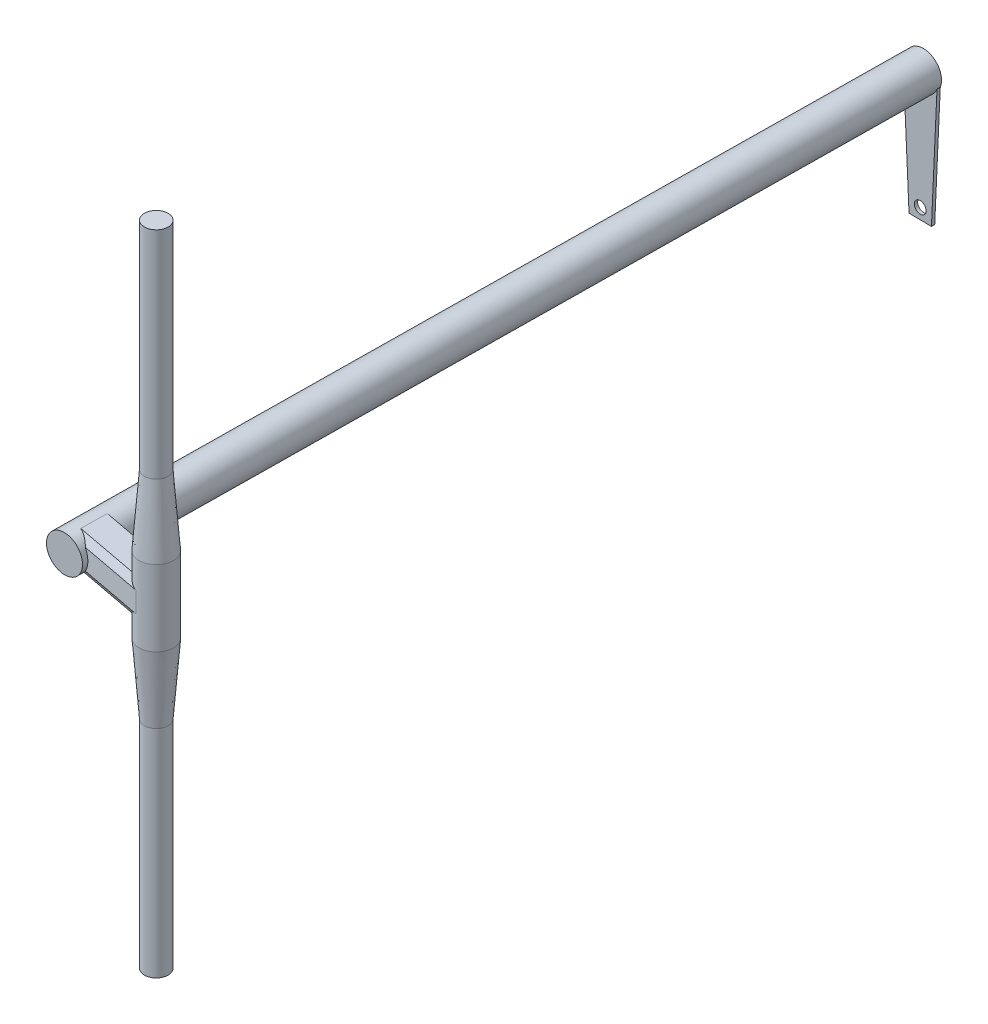
ISO-10303-21;
HEADER;
FILE_DESCRIPTION(('STEP AP214'),'2;1');
FILE_NAME('part.step','',(''),(''),'','','');
FILE_SCHEMA(('AUTOMOTIVE_DESIGN { 1 0 10303 214 1 1 1 1 }'));
ENDSEC;
DATA;
#1=APPLICATION_CONTEXT('core data for automotive mechanical design processes');
#2=APPLICATION_PROTOCOL_DEFINITION('international standard','automotive_design',2000,#1);
#3=PRODUCT_CONTEXT('',#1,'mechanical');
#4=PRODUCT('Part','Part','',(#3));
#5=PRODUCT_RELATED_PRODUCT_CATEGORY('part','',(#4));
#6=PRODUCT_DEFINITION_FORMATION('','',#4);
#7=PRODUCT_DEFINITION_CONTEXT('part definition',#1,'design');
#8=PRODUCT_DEFINITION('design','',#6,#7);
#9=PRODUCT_DEFINITION_SHAPE('','',#8);
#10=(LENGTH_UNIT() NAMED_UNIT(*) SI_UNIT(.MILLI.,.METRE.));
#11=(NAMED_UNIT(*) PLANE_ANGLE_UNIT() SI_UNIT($,.RADIAN.));
#12=(NAMED_UNIT(*) SI_UNIT($,.STERADIAN.) SOLID_ANGLE_UNIT());
#13=UNCERTAINTY_MEASURE_WITH_UNIT(LENGTH_MEASURE(1.E-05),#10,'distance_accuracy_value','');
#14=(GEOMETRIC_REPRESENTATION_CONTEXT(3) GLOBAL_UNCERTAINTY_ASSIGNED_CONTEXT((#13)) GLOBAL_UNIT_ASSIGNED_CONTEXT((#10,
#11,#12)) REPRESENTATION_CONTEXT('',''));
#15=CARTESIAN_POINT('',(0.,0.,0.));
#16=DIRECTION('',(0.,0.,1.));
#17=DIRECTION('',(1.,0.,0.));
#18=AXIS2_PLACEMENT_3D('',#15,#16,#17);
#19=CARTESIAN_POINT('',(-8.79567230162609,0.,724.946643656457));
#20=DIRECTION('',(0.0121319617953464,0.,-0.999926405043389));
#21=DIRECTION('',(-0.999926405043389,0.,-0.0121319617953465));
#22=AXIS2_PLACEMENT_3D('',#19,#20,#21);
#23=CYLINDRICAL_SURFACE('',#22,16.9);
#24=CARTESIAN_POINT('',(0.740049669516222,0.,-60.9955107076468));
#25=DIRECTION('',(0.0121319617953463,0.,-0.999926405043389));
#26=DIRECTION('',(-0.999926405043389,0.,-0.0121319617953463));
#27=AXIS2_PLACEMENT_3D('',#24,#25,#26);
#28=CIRCLE('',#27,16.9);
#29=CARTESIAN_POINT('',(-14.9711540024849,-6.22348315051543,-61.1861324591539));
#30=VERTEX_POINT('',#29);
#31=CARTESIAN_POINT('',(16.4512533415172,-6.22348315051599,-60.8048889561396));
#32=VERTEX_POINT('',#31);
#33=EDGE_CURVE('E218',#30,#32,#28,.T.);
#34=ORIENTED_EDGE('',*,*,#33,.F.);
#35=DIRECTION('',(0.0121319617953464,0.,-0.999926405043389));
#36=VECTOR('',#35,1.);
#37=CARTESIAN_POINT('',(-24.5068759736271,-6.22348315051575,724.75602190495));
#38=LINE('',#37,#36);
#39=CARTESIAN_POINT('',(-15.007549887871,-6.22348315051544,-58.1863532440237));
#40=VERTEX_POINT('',#39);
#41=EDGE_CURVE('E183',#30,#40,#38,.F.);
#42=ORIENTED_EDGE('',*,*,#41,.T.);
#43=CARTESIAN_POINT('',(0.703653784130183,0.,-57.9957314925166));
#44=DIRECTION('',(0.0121319617953463,0.,-0.999926405043389));
#45=DIRECTION('',(-0.999926405043389,0.,-0.0121319617953464));
#46=AXIS2_PLACEMENT_3D('',#43,#44,#45);
#47=CIRCLE('',#46,16.9);
#48=CARTESIAN_POINT('',(16.4148574561311,-6.223483150516,-57.8051097410094));
#49=VERTEX_POINT('',#48);
#50=EDGE_CURVE('E231',#49,#40,#47,.T.);
#51=ORIENTED_EDGE('',*,*,#50,.F.);
#52=DIRECTION('',(0.0121319617953464,0.,-0.999926405043389));
#53=VECTOR('',#52,1.);
#54=CARTESIAN_POINT('',(6.91553137037498,-6.22348315051569,725.137265407964));
#55=LINE('',#54,#53);
#56=EDGE_CURVE('E151',#49,#32,#55,.T.);
#57=ORIENTED_EDGE('',*,*,#56,.T.);
#58=EDGE_LOOP('',(#34,#42,#51,#57));
#59=FACE_BOUND('',#58,.T.);
#60=DIRECTION('',(0.0121319617953464,0.,-0.999926405043389));
#61=VECTOR('',#60,1.);
#62=CARTESIAN_POINT('',(-5.14080792450899,16.5,724.990987594938));
#63=LINE('',#62,#61);
#64=CARTESIAN_POINT('',(-5.00342810130972,16.5,713.668028039474));
#65=VERTEX_POINT('',#64);
#66=CARTESIAN_POINT('',(-4.708790597851,16.5,689.38375937837));
#67=VERTEX_POINT('',#66);
#68=EDGE_CURVE('E223',#65,#67,#63,.T.);
#69=ORIENTED_EDGE('',*,*,#68,.T.);
#70=CARTESIAN_POINT('',(-8.23848059248754,0.,679.022438483589));
#71=DIRECTION('',(-0.16071963414222,-0.500000000000007,0.850981315424248));
#72=DIRECTION('',(-0.239292476715524,-0.816727178648459,-0.525067449233219));
#73=AXIS2_PLACEMENT_3D('',#70,#71,#72);
#74=ELLIPSE('',#73,19.8154807767517,16.9);
#75=CARTESIAN_POINT('',(5.64014694284135,9.50000000000011,687.22540112607));
#76=VERTEX_POINT('',#75);
#77=EDGE_CURVE('E251',#67,#76,#74,.F.);
#78=ORIENTED_EDGE('',*,*,#77,.T.);
#79=CARTESIAN_POINT('',(-8.30604882413043,0.,684.591468464192));
#80=DIRECTION('',(0.185583048072138,0.,-0.982628583071068));
#81=DIRECTION('',(-0.982628583071068,0.,-0.185583048072138));
#82=AXIS2_PLACEMENT_3D('',#79,#80,#81);
#83=ELLIPSE('',#82,17.1607097408691,16.9);
#84=CARTESIAN_POINT('',(5.64014694284137,-9.50000000000009,687.22540112607));
#85=VERTEX_POINT('',#84);
#86=EDGE_CURVE('E221',#76,#85,#83,.T.);
#87=ORIENTED_EDGE('',*,*,#86,.T.);
#88=CARTESIAN_POINT('',(-8.23848059248754,0.,679.022438483589));
#89=DIRECTION('',(-0.16071963414222,0.500000000000007,0.850981315424248));
#90=DIRECTION('',(-0.239292476715524,0.816727178648459,-0.525067449233219));
#91=AXIS2_PLACEMENT_3D('',#88,#89,#90);
#92=ELLIPSE('',#91,19.8154807767517,16.9);
#93=CARTESIAN_POINT('',(-4.70879059785085,-16.5,689.38375937837));
#94=VERTEX_POINT('',#93);
#95=EDGE_CURVE('E258',#85,#94,#92,.F.);
#96=ORIENTED_EDGE('',*,*,#95,.T.);
#97=DIRECTION('',(0.0121319617953464,0.,-0.999926405043389));
#98=VECTOR('',#97,1.);
#99=CARTESIAN_POINT('',(-5.14080792450884,-16.5,724.990987594938));
#100=LINE('',#99,#98);
#101=CARTESIAN_POINT('',(-5.00342810130957,-16.5,713.668028039474));
#102=VERTEX_POINT('',#101);
#103=EDGE_CURVE('E229',#94,#102,#100,.F.);
#104=ORIENTED_EDGE('',*,*,#103,.T.);
#105=CARTESIAN_POINT('',(-8.76782879533736,0.,722.651758656262));
#106=DIRECTION('',(0.16071963414222,0.500000000000004,-0.85098131542425));
#107=DIRECTION('',(-0.239292476715526,-0.81672717864846,-0.525067449233216));
#108=AXIS2_PLACEMENT_3D('',#105,#106,#107);
#109=ELLIPSE('',#108,19.8154807767517,16.9);
#110=CARTESIAN_POINT('',(5.24593520327712,-9.50000000000042,719.716661337536));
#111=VERTEX_POINT('',#110);
#112=EDGE_CURVE('E70',#102,#111,#109,.F.);
#113=ORIENTED_EDGE('',*,*,#112,.T.);
#114=CARTESIAN_POINT('',(-8.70026056369447,0.,717.082728675658));
#115=DIRECTION('',(-0.185583048072138,0.,0.982628583071068));
#116=DIRECTION('',(-0.982628583071068,0.,-0.185583048072138));
#117=AXIS2_PLACEMENT_3D('',#114,#115,#116);
#118=ELLIPSE('',#117,17.1607097408691,16.9);
#119=CARTESIAN_POINT('',(5.24593520327709,9.50000000000046,719.716661337536));
#120=VERTEX_POINT('',#119);
#121=EDGE_CURVE('E227',#111,#120,#118,.T.);
#122=ORIENTED_EDGE('',*,*,#121,.T.);
#123=CARTESIAN_POINT('',(-8.76782879533736,0.,722.651758656262));
#124=DIRECTION('',(0.16071963414222,-0.500000000000004,-0.85098131542425));
#125=DIRECTION('',(-0.239292476715526,0.81672717864846,-0.525067449233216));
#126=AXIS2_PLACEMENT_3D('',#123,#124,#125);
#127=ELLIPSE('',#126,19.8154807767517,16.9);
#128=EDGE_CURVE('E265',#120,#65,#127,.F.);
#129=ORIENTED_EDGE('',*,*,#128,.T.);
#130=EDGE_LOOP('',(#69,#78,#87,#96,#104,#113,#122,#129));
#131=FACE_BOUND('',#130,.T.);
#132=CARTESIAN_POINT('',(-8.79567230162609,0.,724.946643656457));
#133=DIRECTION('',(-0.0121319617953462,0.,0.999926405043389));
#134=DIRECTION('',(0.999926405043389,0.,0.0121319617953462));
#135=AXIS2_PLACEMENT_3D('',#132,#133,#134);
#136=CIRCLE('',#135,16.9);
#137=CARTESIAN_POINT('',(8.1030839436072,0.,725.151673810799));
#138=VERTEX_POINT('',#137);
#139=EDGE_CURVE('E213',#138,#138,#136,.T.);
#140=ORIENTED_EDGE('',*,*,#139,.F.);
#141=EDGE_LOOP('',(#140));
#142=FACE_BOUND('',#141,.T.);
#143=ADVANCED_FACE('F59',(#59,#131,#142),#23,.T.);
#144=CARTESIAN_POINT('',(-8.79567230172777,-4.28049522910312E-12,724.946643656456));
#145=DIRECTION('',(0.0121319617954866,0.,-0.999926405043388));
#146=DIRECTION('',(-0.999926405043388,0.,-0.0121319617954866));
#147=AXIS2_PLACEMENT_3D('',#144,#145,#146);
#148=PLANE('',#147);
#149=ORIENTED_EDGE('',*,*,#139,.T.);
#150=EDGE_LOOP('',(#149));
#151=FACE_BOUND('',#150,.T.);
#152=ADVANCED_FACE('F304',(#151),#148,.F.);
#153=CARTESIAN_POINT('',(0.740049669516125,0.,-60.9955107076468));
#154=DIRECTION('',(0.0121319617953463,0.,-0.999926405043389));
#155=DIRECTION('',(-0.999926405043389,0.,-0.0121319617953463));
#156=AXIS2_PLACEMENT_3D('',#153,#154,#155);
#157=PLANE('',#156);
#158=ORIENTED_EDGE('',*,*,#33,.T.);
#159=DIRECTION('',(-0.0461658037438821,-0.998933633845071,-0.00056012298949935));
#160=VECTOR('',#159,1.);
#161=CARTESIAN_POINT('',(16.7388721502104,0.,-60.8013993189212));
#162=LINE('',#161,#160);
#163=CARTESIAN_POINT('',(11.2392769224717,-119.,-60.8681251087956));
#164=VERTEX_POINT('',#163);
#165=EDGE_CURVE('E180',#32,#164,#162,.T.);
#166=ORIENTED_EDGE('',*,*,#165,.T.);
#167=DIRECTION('',(-0.999926405043389,0.,-0.0121319617953463));
#168=VECTOR('',#167,1.);
#169=CARTESIAN_POINT('',(11.2392769224717,-119.,-60.8681251087956));
#170=LINE('',#169,#168);
#171=CARTESIAN_POINT('',(-9.75917758343947,-119.,-61.1228963064979));
#172=VERTEX_POINT('',#171);
#173=EDGE_CURVE('E170',#164,#172,#170,.T.);
#174=ORIENTED_EDGE('',*,*,#173,.T.);
#175=DIRECTION('',(-0.0461658037438821,0.998933633845071,-0.00056012298949935));
#176=VECTOR('',#175,1.);
#177=CARTESIAN_POINT('',(-9.75917758343947,-119.,-61.1228963064979));
#178=LINE('',#177,#176);
#179=EDGE_CURVE('E159',#172,#30,#178,.T.);
#180=ORIENTED_EDGE('',*,*,#179,.T.);
#181=EDGE_LOOP('',(#158,#166,#174,#180));
#182=FACE_BOUND('',#181,.T.);
#183=CARTESIAN_POINT('',(0.740049669515793,-109.,-60.9955107076468));
#184=DIRECTION('',(0.0121319617953463,0.,-0.999926405043389));
#185=DIRECTION('',(-0.999926405043389,0.,-0.0121319617953463));
#186=AXIS2_PLACEMENT_3D('',#183,#184,#185);
#187=CIRCLE('',#186,5.50000000000023);
#188=CARTESIAN_POINT('',(-4.75954555822308,-109.,-61.0622364975212));
#189=VERTEX_POINT('',#188);
#190=EDGE_CURVE('E533',#189,#189,#187,.T.);
#191=ORIENTED_EDGE('',*,*,#190,.F.);
#192=EDGE_LOOP('',(#191));
#193=FACE_BOUND('',#192,.T.);
#194=ADVANCED_FACE('F312',(#182,#193),#157,.T.);
#195=CARTESIAN_POINT('',(81.6028370847578,-16.5,734.137722190684));
#196=DIRECTION('',(0.,-1.,0.));
#197=DIRECTION('',(0.,0.,-1.));
#198=AXIS2_PLACEMENT_3D('',#195,#196,#197);
#199=PLANE('',#198);
#200=ORIENTED_EDGE('',*,*,#103,.F.);
#201=DIRECTION('',(0.982628583071068,0.,0.185583048072138));
#202=VECTOR('',#201,1.);
#203=CARTESIAN_POINT('',(86.7914696637359,-16.5,706.664853671056));
#204=LINE('',#203,#202);
#205=CARTESIAN_POINT('',(57.9784640597501,-16.5,701.223117600856));
#206=VERTEX_POINT('',#205);
#207=EDGE_CURVE('E247',#94,#206,#204,.T.);
#208=ORIENTED_EDGE('',*,*,#207,.T.);
#209=CARTESIAN_POINT('',(66.2043276983739,-16.5,714.946643656457));
#210=DIRECTION('',(0.,-1.,0.));
#211=DIRECTION('',(0.,0.,-1.));
#212=AXIS2_PLACEMENT_3D('',#209,#210,#211);
#213=CIRCLE('',#212,16.);
#214=CARTESIAN_POINT('',(53.5398564401023,-16.5,724.724739981837));
#215=VERTEX_POINT('',#214);
#216=EDGE_CURVE('E204',#215,#206,#213,.T.);
#217=ORIENTED_EDGE('',*,*,#216,.F.);
#218=DIRECTION('',(-0.982628583071068,0.,-0.185583048072138));
#219=VECTOR('',#218,1.);
#220=CARTESIAN_POINT('',(82.3528620440881,-16.5,730.166476052037));
#221=LINE('',#220,#219);
#222=EDGE_CURVE('E244',#215,#102,#221,.T.);
#223=ORIENTED_EDGE('',*,*,#222,.T.);
#224=EDGE_LOOP('',(#200,#208,#217,#223));
#225=FACE_BOUND('',#224,.T.);
#226=ADVANCED_FACE('F277',(#225),#199,.T.);
#227=CARTESIAN_POINT('',(81.6028370847578,16.5,734.137722190684));
#228=DIRECTION('',(0.,1.,0.));
#229=DIRECTION('',(0.,0.,1.));
#230=AXIS2_PLACEMENT_3D('',#227,#228,#229);
#231=PLANE('',#230);
#232=CARTESIAN_POINT('',(66.2043276983739,16.5,714.946643656457));
#233=DIRECTION('',(0.,1.,0.));
#234=DIRECTION('',(0.,0.,1.));
#235=AXIS2_PLACEMENT_3D('',#232,#233,#234);
#236=CIRCLE('',#235,16.);
#237=CARTESIAN_POINT('',(57.9784640597501,16.5,701.223117600856));
#238=VERTEX_POINT('',#237);
#239=CARTESIAN_POINT('',(53.5398564401023,16.5,724.724739981837));
#240=VERTEX_POINT('',#239);
#241=EDGE_CURVE('E206',#238,#240,#236,.T.);
#242=ORIENTED_EDGE('',*,*,#241,.F.);
#243=DIRECTION('',(-0.982628583071068,0.,-0.185583048072138));
#244=VECTOR('',#243,1.);
#245=CARTESIAN_POINT('',(86.7914696637359,16.5,706.664853671056));
#246=LINE('',#245,#244);
#247=EDGE_CURVE('E240',#238,#67,#246,.T.);
#248=ORIENTED_EDGE('',*,*,#247,.T.);
#249=ORIENTED_EDGE('',*,*,#68,.F.);
#250=DIRECTION('',(0.982628583071068,0.,0.185583048072138));
#251=VECTOR('',#250,1.);
#252=CARTESIAN_POINT('',(82.3528620440881,16.5,730.166476052037));
#253=LINE('',#252,#251);
#254=EDGE_CURVE('E232',#65,#240,#253,.T.);
#255=ORIENTED_EDGE('',*,*,#254,.T.);
#256=EDGE_LOOP('',(#242,#248,#249,#255));
#257=FACE_BOUND('',#256,.T.);
#258=ADVANCED_FACE('F292',(#257),#231,.T.);
#259=CARTESIAN_POINT('',(81.6028370847578,16.5,734.137722190684));
#260=DIRECTION('',(-0.185583048072138,0.,0.982628583071068));
#261=DIRECTION('',(0.982628583071068,0.,0.185583048072138));
#262=AXIS2_PLACEMENT_3D('',#259,#260,#261);
#263=PLANE('',#262);
#264=DIRECTION('',(0.,1.,0.));
#265=VECTOR('',#264,1.);
#266=CARTESIAN_POINT('',(63.2349989292197,300.,730.668700985594));
#267=LINE('',#266,#265);
#268=CARTESIAN_POINT('',(63.2349989292197,-9.5000000000004,730.668700985594));
#269=VERTEX_POINT('',#268);
#270=CARTESIAN_POINT('',(63.2349989292197,9.50000000000045,730.668700985594));
#271=VERTEX_POINT('',#270);
#272=EDGE_CURVE('E207',#269,#271,#267,.T.);
#273=ORIENTED_EDGE('',*,*,#272,.T.);
#274=DIRECTION('',(-0.982628583071068,0.,-0.185583048072138));
#275=VECTOR('',#274,1.);
#276=CARTESIAN_POINT('',(81.6028370847578,9.50000000000046,734.137722190684));
#277=LINE('',#276,#275);
#278=EDGE_CURVE('E252',#271,#120,#277,.T.);
#279=ORIENTED_EDGE('',*,*,#278,.T.);
#280=ORIENTED_EDGE('',*,*,#121,.F.);
#281=DIRECTION('',(0.982628583071068,0.,0.185583048072138));
#282=VECTOR('',#281,1.);
#283=CARTESIAN_POINT('',(81.6028370847578,-9.50000000000042,734.137722190684));
#284=LINE('',#283,#282);
#285=EDGE_CURVE('E82',#111,#269,#284,.T.);
#286=ORIENTED_EDGE('',*,*,#285,.T.);
#287=EDGE_LOOP('',(#273,#279,#280,#286));
#288=FACE_BOUND('',#287,.T.);
#289=ADVANCED_FACE('F268',(#288),#263,.T.);
#290=CARTESIAN_POINT('',(87.5414946230662,16.5,702.693607532409));
#291=DIRECTION('',(0.185583048072138,0.,-0.982628583071068));
#292=DIRECTION('',(-0.982628583071068,0.,-0.185583048072138));
#293=AXIS2_PLACEMENT_3D('',#290,#291,#292);
#294=PLANE('',#293);
#295=ORIENTED_EDGE('',*,*,#86,.F.);
#296=DIRECTION('',(0.982628583071068,0.,0.185583048072138));
#297=VECTOR('',#296,1.);
#298=CARTESIAN_POINT('',(87.5414946230662,9.50000000000012,702.693607532409));
#299=LINE('',#298,#297);
#300=CARTESIAN_POINT('',(69.1736564675281,9.50000000000012,699.22458632732));
#301=VERTEX_POINT('',#300);
#302=EDGE_CURVE('E243',#76,#301,#299,.T.);
#303=ORIENTED_EDGE('',*,*,#302,.T.);
#304=DIRECTION('',(0.,1.,0.));
#305=VECTOR('',#304,1.);
#306=CARTESIAN_POINT('',(69.1736564675281,300.,699.22458632732));
#307=LINE('',#306,#305);
#308=CARTESIAN_POINT('',(69.1736564675281,-9.50000000000012,699.22458632732));
#309=VERTEX_POINT('',#308);
#310=EDGE_CURVE('E208',#309,#301,#307,.T.);
#311=ORIENTED_EDGE('',*,*,#310,.F.);
#312=DIRECTION('',(-0.982628583071068,0.,-0.185583048072138));
#313=VECTOR('',#312,1.);
#314=CARTESIAN_POINT('',(87.5414946230662,-9.5000000000001,702.693607532409));
#315=LINE('',#314,#313);
#316=EDGE_CURVE('E239',#309,#85,#315,.T.);
#317=ORIENTED_EDGE('',*,*,#316,.T.);
#318=EDGE_LOOP('',(#295,#303,#311,#317));
#319=FACE_BOUND('',#318,.T.);
#320=ADVANCED_FACE('F281',(#319),#294,.T.);
#321=CARTESIAN_POINT('',(66.2043276983739,300.,714.946643656457));
#322=DIRECTION('',(0.,1.,0.));
#323=DIRECTION('',(-1.,0.,0.));
#324=AXIS2_PLACEMENT_3D('',#321,#322,#323);
#325=CYLINDRICAL_SURFACE('',#324,16.);
#326=CARTESIAN_POINT('',(66.2043276983739,34.9999999999996,714.946643656457));
#327=DIRECTION('',(0.,1.,0.));
#328=DIRECTION('',(-1.,0.,0.));
#329=AXIS2_PLACEMENT_3D('',#326,#327,#328);
#330=CIRCLE('',#329,16.);
#331=CARTESIAN_POINT('',(50.2043276983738,34.9999999999996,714.946643656457));
#332=VERTEX_POINT('',#331);
#333=EDGE_CURVE('E193',#332,#332,#330,.T.);
#334=ORIENTED_EDGE('',*,*,#333,.F.);
#335=EDGE_LOOP('',(#334));
#336=FACE_BOUND('',#335,.T.);
#337=CARTESIAN_POINT('',(66.2043276983739,-34.9999999999996,714.946643656457));
#338=DIRECTION('',(0.,1.,0.));
#339=DIRECTION('',(-1.,0.,0.));
#340=AXIS2_PLACEMENT_3D('',#337,#338,#339);
#341=CIRCLE('',#340,15.9999999999999);
#342=CARTESIAN_POINT('',(50.2043276983739,-34.9999999999996,714.946643656457));
#343=VERTEX_POINT('',#342);
#344=EDGE_CURVE('E197',#343,#343,#341,.T.);
#345=ORIENTED_EDGE('',*,*,#344,.T.);
#346=EDGE_LOOP('',(#345));
#347=FACE_BOUND('',#346,.T.);
#348=ORIENTED_EDGE('',*,*,#272,.F.);
#349=CARTESIAN_POINT('',(66.2043276983739,-37.212812921102,714.946643656457));
#350=DIRECTION('',(0.16071963414222,0.500000000000004,-0.85098131542425));
#351=DIRECTION('',(-0.0927915240360698,0.866025403784437,0.491314291535538));
#352=AXIS2_PLACEMENT_3D('',#349,#350,#351);
#353=ELLIPSE('',#352,31.9999999999997,16.);
#354=EDGE_CURVE('E12',#269,#215,#353,.F.);
#355=ORIENTED_EDGE('',*,*,#354,.T.);
#356=ORIENTED_EDGE('',*,*,#216,.T.);
#357=CARTESIAN_POINT('',(66.2043276983739,-37.212812921102,714.946643656457));
#358=DIRECTION('',(-0.16071963414222,0.500000000000007,0.850981315424248));
#359=DIRECTION('',(0.0927915240360706,0.866025403784435,-0.491314291535541));
#360=AXIS2_PLACEMENT_3D('',#357,#358,#359);
#361=ELLIPSE('',#360,31.9999999999995,16.);
#362=EDGE_CURVE('E256',#206,#309,#361,.F.);
#363=ORIENTED_EDGE('',*,*,#362,.T.);
#364=ORIENTED_EDGE('',*,*,#310,.T.);
#365=CARTESIAN_POINT('',(66.2043276983739,37.2128129211019,714.946643656457));
#366=DIRECTION('',(-0.16071963414222,-0.500000000000007,0.850981315424248));
#367=DIRECTION('',(-0.0927915240360704,0.866025403784435,0.491314291535541));
#368=AXIS2_PLACEMENT_3D('',#365,#366,#367);
#369=ELLIPSE('',#368,31.9999999999995,16.);
#370=EDGE_CURVE('E257',#301,#238,#369,.F.);
#371=ORIENTED_EDGE('',*,*,#370,.T.);
#372=ORIENTED_EDGE('',*,*,#241,.T.);
#373=CARTESIAN_POINT('',(66.2043276983739,37.2128129211021,714.946643656457));
#374=DIRECTION('',(0.16071963414222,-0.500000000000004,-0.85098131542425));
#375=DIRECTION('',(0.09279152403607,0.866025403784437,-0.491314291535538));
#376=AXIS2_PLACEMENT_3D('',#373,#374,#375);
#377=ELLIPSE('',#376,31.9999999999997,16.);
#378=EDGE_CURVE('E73',#240,#271,#377,.F.);
#379=ORIENTED_EDGE('',*,*,#378,.T.);
#380=EDGE_LOOP('',(#348,#355,#356,#363,#364,#371,#372,#379));
#381=FACE_BOUND('',#380,.T.);
#382=ADVANCED_FACE('F271',(#336,#347,#381),#325,.T.);
#383=CARTESIAN_POINT('',(55.204327698374,300.,714.946643656457));
#384=DIRECTION('',(0.,1.,0.));
#385=DIRECTION('',(-1.,0.,0.));
#386=AXIS2_PLACEMENT_3D('',#383,#384,#385);
#387=PLANE('',#386);
#388=CARTESIAN_POINT('',(66.2043276983739,300.,714.946643656457));
#389=DIRECTION('',(0.,1.,0.));
#390=DIRECTION('',(-1.,0.,0.));
#391=AXIS2_PLACEMENT_3D('',#388,#389,#390);
#392=CIRCLE('',#391,10.9999999999999);
#393=CARTESIAN_POINT('',(55.204327698374,300.,714.946643656457));
#394=VERTEX_POINT('',#393);
#395=EDGE_CURVE('E190',#394,#394,#392,.T.);
#396=ORIENTED_EDGE('',*,*,#395,.T.);
#397=EDGE_LOOP('',(#396));
#398=FACE_BOUND('',#397,.T.);
#399=ADVANCED_FACE('F362',(#398),#387,.T.);
#400=CARTESIAN_POINT('',(66.2043276983738,-300.,714.946643656457));
#401=DIRECTION('',(0.,-1.,0.));
#402=DIRECTION('',(1.,0.,0.));
#403=AXIS2_PLACEMENT_3D('',#400,#401,#402);
#404=PLANE('',#403);
#405=CARTESIAN_POINT('',(66.2043276983738,-300.,714.946643656457));
#406=DIRECTION('',(0.,1.,0.));
#407=DIRECTION('',(-1.,0.,0.));
#408=AXIS2_PLACEMENT_3D('',#405,#406,#407);
#409=CIRCLE('',#408,11.);
#410=CARTESIAN_POINT('',(55.2043276983738,-300.,714.946643656457));
#411=VERTEX_POINT('',#410);
#412=EDGE_CURVE('E205',#411,#411,#409,.T.);
#413=ORIENTED_EDGE('',*,*,#412,.F.);
#414=EDGE_LOOP('',(#413));
#415=FACE_BOUND('',#414,.T.);
#416=ADVANCED_FACE('F373',(#415),#404,.T.);
#417=CARTESIAN_POINT('',(66.2043276983739,300.,714.946643656457));
#418=DIRECTION('',(0.,1.,0.));
#419=DIRECTION('',(-1.,0.,0.));
#420=AXIS2_PLACEMENT_3D('',#417,#418,#419);
#421=CYLINDRICAL_SURFACE('',#420,11.);
#422=ORIENTED_EDGE('',*,*,#412,.T.);
#423=EDGE_LOOP('',(#422));
#424=FACE_BOUND('',#423,.T.);
#425=CARTESIAN_POINT('',(66.2043276983738,-100.,714.946643656457));
#426=DIRECTION('',(0.,1.,0.));
#427=DIRECTION('',(-1.,0.,0.));
#428=AXIS2_PLACEMENT_3D('',#425,#426,#427);
#429=CIRCLE('',#428,11.);
#430=CARTESIAN_POINT('',(55.2043276983738,-100.,714.946643656457));
#431=VERTEX_POINT('',#430);
#432=EDGE_CURVE('E199',#431,#431,#429,.T.);
#433=ORIENTED_EDGE('',*,*,#432,.F.);
#434=EDGE_LOOP('',(#433));
#435=FACE_BOUND('',#434,.T.);
#436=ADVANCED_FACE('F367',(#424,#435),#421,.T.);
#437=CARTESIAN_POINT('',(66.2043276983739,-34.9999999999996,714.946643656457));
#438=DIRECTION('',(0.,1.,0.));
#439=DIRECTION('',(-1.,0.,0.));
#440=AXIS2_PLACEMENT_3D('',#437,#438,#439);
#441=CONICAL_SURFACE('',#440,15.9999999999999,0.0767718912697761);
#442=ORIENTED_EDGE('',*,*,#432,.T.);
#443=EDGE_LOOP('',(#442));
#444=FACE_BOUND('',#443,.T.);
#445=ORIENTED_EDGE('',*,*,#344,.F.);
#446=EDGE_LOOP('',(#445));
#447=FACE_BOUND('',#446,.T.);
#448=ADVANCED_FACE('F365',(#444,#447),#441,.T.);
#449=CARTESIAN_POINT('',(66.2043276983739,100.,714.946643656457));
#450=DIRECTION('',(0.,-1.,0.));
#451=DIRECTION('',(1.,0.,0.));
#452=AXIS2_PLACEMENT_3D('',#449,#450,#451);
#453=CONICAL_SURFACE('',#452,10.9999999999999,0.0767718912697794);
#454=ORIENTED_EDGE('',*,*,#333,.T.);
#455=EDGE_LOOP('',(#454));
#456=FACE_BOUND('',#455,.T.);
#457=CARTESIAN_POINT('',(66.2043276983739,100.,714.946643656457));
#458=DIRECTION('',(0.,1.,0.));
#459=DIRECTION('',(-1.,0.,0.));
#460=AXIS2_PLACEMENT_3D('',#457,#458,#459);
#461=CIRCLE('',#460,10.9999999999999);
#462=CARTESIAN_POINT('',(55.204327698374,100.,714.946643656457));
#463=VERTEX_POINT('',#462);
#464=EDGE_CURVE('E188',#463,#463,#461,.T.);
#465=ORIENTED_EDGE('',*,*,#464,.F.);
#466=EDGE_LOOP('',(#465));
#467=FACE_BOUND('',#466,.T.);
#468=ADVANCED_FACE('F356',(#456,#467),#453,.T.);
#469=CARTESIAN_POINT('',(66.2043276983739,300.,714.946643656457));
#470=DIRECTION('',(0.,1.,0.));
#471=DIRECTION('',(-1.,0.,0.));
#472=AXIS2_PLACEMENT_3D('',#469,#470,#471);
#473=CYLINDRICAL_SURFACE('',#472,10.9999999999999);
#474=ORIENTED_EDGE('',*,*,#464,.T.);
#475=EDGE_LOOP('',(#474));
#476=FACE_BOUND('',#475,.T.);
#477=ORIENTED_EDGE('',*,*,#395,.F.);
#478=EDGE_LOOP('',(#477));
#479=FACE_BOUND('',#478,.T.);
#480=ADVANCED_FACE('F346',(#476,#479),#473,.T.);
#481=CARTESIAN_POINT('',(-9.7955734688255,-119.,-58.1231170913677));
#482=DIRECTION('',(-0.998860117367631,-0.046169201564268,-0.0121190246818949));
#483=DIRECTION('',(0.0461725923906261,-0.998933477120438,0.));
#484=AXIS2_PLACEMENT_3D('',#481,#482,#483);
#485=PLANE('',#484);
#486=ORIENTED_EDGE('',*,*,#41,.F.);
#487=ORIENTED_EDGE('',*,*,#179,.F.);
#488=DIRECTION('',(0.0121319617953463,0.,-0.999926405043389));
#489=VECTOR('',#488,1.);
#490=CARTESIAN_POINT('',(-9.7955734688255,-119.,-58.1231170913677));
#491=LINE('',#490,#489);
#492=CARTESIAN_POINT('',(-9.7955734688255,-119.,-58.1231170913677));
#493=VERTEX_POINT('',#492);
#494=EDGE_CURVE('E166',#493,#172,#491,.T.);
#495=ORIENTED_EDGE('',*,*,#494,.F.);
#496=DIRECTION('',(-0.0461658037438821,0.998933633845071,-0.00056012298949935));
#497=VECTOR('',#496,1.);
#498=CARTESIAN_POINT('',(-9.7955734688255,-119.,-58.1231170913677));
#499=LINE('',#498,#497);
#500=EDGE_CURVE('E169',#493,#40,#499,.T.);
#501=ORIENTED_EDGE('',*,*,#500,.T.);
#502=EDGE_LOOP('',(#486,#487,#495,#501));
#503=FACE_BOUND('',#502,.T.);
#504=ADVANCED_FACE('F350',(#503),#485,.T.);
#505=CARTESIAN_POINT('',(16.7024762648243,0.,-57.801620103791));
#506=DIRECTION('',(0.998860117367631,-0.046169201564268,0.0121190246818949));
#507=DIRECTION('',(0.0461725923906261,0.998933477120438,0.));
#508=AXIS2_PLACEMENT_3D('',#505,#506,#507);
#509=PLANE('',#508);
#510=ORIENTED_EDGE('',*,*,#56,.F.);
#511=DIRECTION('',(-0.0461658037438821,-0.998933633845071,-0.00056012298949935));
#512=VECTOR('',#511,1.);
#513=CARTESIAN_POINT('',(16.7024762648243,0.,-57.801620103791));
#514=LINE('',#513,#512);
#515=CARTESIAN_POINT('',(11.2028810370857,-119.,-57.8683458936654));
#516=VERTEX_POINT('',#515);
#517=EDGE_CURVE('E149',#49,#516,#514,.T.);
#518=ORIENTED_EDGE('',*,*,#517,.T.);
#519=DIRECTION('',(0.0121319617953463,0.,-0.999926405043389));
#520=VECTOR('',#519,1.);
#521=CARTESIAN_POINT('',(11.2028810370857,-119.,-57.8683458936654));
#522=LINE('',#521,#520);
#523=EDGE_CURVE('E155',#516,#164,#522,.T.);
#524=ORIENTED_EDGE('',*,*,#523,.T.);
#525=ORIENTED_EDGE('',*,*,#165,.F.);
#526=EDGE_LOOP('',(#510,#518,#524,#525));
#527=FACE_BOUND('',#526,.T.);
#528=ADVANCED_FACE('F152',(#527),#509,.T.);
#529=CARTESIAN_POINT('',(11.2028810370857,-119.,-57.8683458936654));
#530=DIRECTION('',(0.,-1.,0.));
#531=DIRECTION('',(0.,0.,-1.));
#532=AXIS2_PLACEMENT_3D('',#529,#530,#531);
#533=PLANE('',#532);
#534=ORIENTED_EDGE('',*,*,#173,.F.);
#535=ORIENTED_EDGE('',*,*,#523,.F.);
#536=DIRECTION('',(-0.999926405043389,0.,-0.0121319617953463));
#537=VECTOR('',#536,1.);
#538=CARTESIAN_POINT('',(11.2028810370857,-119.,-57.8683458936654));
#539=LINE('',#538,#537);
#540=EDGE_CURVE('E158',#516,#493,#539,.T.);
#541=ORIENTED_EDGE('',*,*,#540,.T.);
#542=ORIENTED_EDGE('',*,*,#494,.T.);
#543=EDGE_LOOP('',(#534,#535,#541,#542));
#544=FACE_BOUND('',#543,.T.);
#545=ADVANCED_FACE('F165',(#544),#533,.T.);
#546=CARTESIAN_POINT('',(0.703653784130088,0.,-57.9957314925166));
#547=DIRECTION('',(0.0121319617953463,0.,-0.999926405043389));
#548=DIRECTION('',(-0.999926405043389,0.,-0.0121319617953464));
#549=AXIS2_PLACEMENT_3D('',#546,#547,#548);
#550=PLANE('',#549);
#551=CARTESIAN_POINT('',(0.703653784129754,-109.,-57.9957314925166));
#552=DIRECTION('',(0.0121319617953463,0.,-0.999926405043389));
#553=DIRECTION('',(-0.999926405043389,0.,-0.0121319617953463));
#554=AXIS2_PLACEMENT_3D('',#551,#552,#553);
#555=CIRCLE('',#554,5.50000000000023);
#556=CARTESIAN_POINT('',(-4.79594144360912,-109.,-58.062457282391));
#557=VERTEX_POINT('',#556);
#558=EDGE_CURVE('E177',#557,#557,#555,.T.);
#559=ORIENTED_EDGE('',*,*,#558,.T.);
#560=EDGE_LOOP('',(#559));
#561=FACE_BOUND('',#560,.T.);
#562=ORIENTED_EDGE('',*,*,#517,.F.);
#563=ORIENTED_EDGE('',*,*,#50,.T.);
#564=ORIENTED_EDGE('',*,*,#500,.F.);
#565=ORIENTED_EDGE('',*,*,#540,.F.);
#566=EDGE_LOOP('',(#562,#563,#564,#565));
#567=FACE_BOUND('',#566,.T.);
#568=ADVANCED_FACE('F171',(#561,#567),#550,.F.);
#569=CARTESIAN_POINT('',(0.703653784129754,-109.,-57.9957314925166));
#570=DIRECTION('',(0.0121319617953463,0.,-0.999926405043389));
#571=DIRECTION('',(-0.999926405043389,0.,-0.0121319617953463));
#572=AXIS2_PLACEMENT_3D('',#569,#570,#571);
#573=CYLINDRICAL_SURFACE('',#572,5.50000000000023);
#574=ORIENTED_EDGE('',*,*,#558,.F.);
#575=EDGE_LOOP('',(#574));
#576=FACE_BOUND('',#575,.T.);
#577=ORIENTED_EDGE('',*,*,#190,.T.);
#578=EDGE_LOOP('',(#577));
#579=FACE_BOUND('',#578,.T.);
#580=ADVANCED_FACE('F330',(#576,#579),#573,.F.);
#581=CARTESIAN_POINT('',(86.7914696637359,16.5,706.664853671056));
#582=DIRECTION('',(-0.16071963414222,-0.500000000000007,0.850981315424248));
#583=DIRECTION('',(-0.982628583071068,0.,-0.185583048072138));
#584=AXIS2_PLACEMENT_3D('',#581,#582,#583);
#585=PLANE('',#584);
#586=ORIENTED_EDGE('',*,*,#370,.F.);
#587=ORIENTED_EDGE('',*,*,#302,.F.);
#588=ORIENTED_EDGE('',*,*,#77,.F.);
#589=ORIENTED_EDGE('',*,*,#247,.F.);
#590=EDGE_LOOP('',(#586,#587,#588,#589));
#591=FACE_BOUND('',#590,.T.);
#592=ADVANCED_FACE('F287',(#591),#585,.F.);
#593=CARTESIAN_POINT('',(87.5414946230662,-9.5000000000001,702.693607532409));
#594=DIRECTION('',(-0.16071963414222,0.500000000000007,0.850981315424248));
#595=DIRECTION('',(-0.982628583071068,0.,-0.185583048072138));
#596=AXIS2_PLACEMENT_3D('',#593,#594,#595);
#597=PLANE('',#596);
#598=ORIENTED_EDGE('',*,*,#362,.F.);
#599=ORIENTED_EDGE('',*,*,#207,.F.);
#600=ORIENTED_EDGE('',*,*,#95,.F.);
#601=ORIENTED_EDGE('',*,*,#316,.F.);
#602=EDGE_LOOP('',(#598,#599,#600,#601));
#603=FACE_BOUND('',#602,.T.);
#604=ADVANCED_FACE('F279',(#603),#597,.F.);
#605=CARTESIAN_POINT('',(81.6028370847578,9.50000000000046,734.137722190684));
#606=DIRECTION('',(0.16071963414222,-0.500000000000004,-0.85098131542425));
#607=DIRECTION('',(-0.982628583071068,0.,-0.185583048072138));
#608=AXIS2_PLACEMENT_3D('',#605,#606,#607);
#609=PLANE('',#608);
#610=ORIENTED_EDGE('',*,*,#378,.F.);
#611=ORIENTED_EDGE('',*,*,#254,.F.);
#612=ORIENTED_EDGE('',*,*,#128,.F.);
#613=ORIENTED_EDGE('',*,*,#278,.F.);
#614=EDGE_LOOP('',(#610,#611,#612,#613));
#615=FACE_BOUND('',#614,.T.);
#616=ADVANCED_FACE('F298',(#615),#609,.F.);
#617=CARTESIAN_POINT('',(82.3528620440881,-16.5,730.166476052037));
#618=DIRECTION('',(0.16071963414222,0.500000000000004,-0.85098131542425));
#619=DIRECTION('',(-0.982628583071068,0.,-0.185583048072138));
#620=AXIS2_PLACEMENT_3D('',#617,#618,#619);
#621=PLANE('',#620);
#622=ORIENTED_EDGE('',*,*,#354,.F.);
#623=ORIENTED_EDGE('',*,*,#285,.F.);
#624=ORIENTED_EDGE('',*,*,#112,.F.);
#625=ORIENTED_EDGE('',*,*,#222,.F.);
#626=EDGE_LOOP('',(#622,#623,#624,#625));
#627=FACE_BOUND('',#626,.T.);
#628=ADVANCED_FACE('F62',(#627),#621,.F.);
#629=CLOSED_SHELL('',(#143,#152,#194,#226,#258,#289,#320,#382,#399,#416,#436,#448,#468,#480,
#504,#528,#545,#568,#580,#592,#604,#616,#628));
#630=MANIFOLD_SOLID_BREP('B2',#629);
#631=ADVANCED_BREP_SHAPE_REPRESENTATION('',(#18,#630),#14);
#632=SHAPE_DEFINITION_REPRESENTATION(#9,#631);
ENDSEC;
END-ISO-10303-21;
